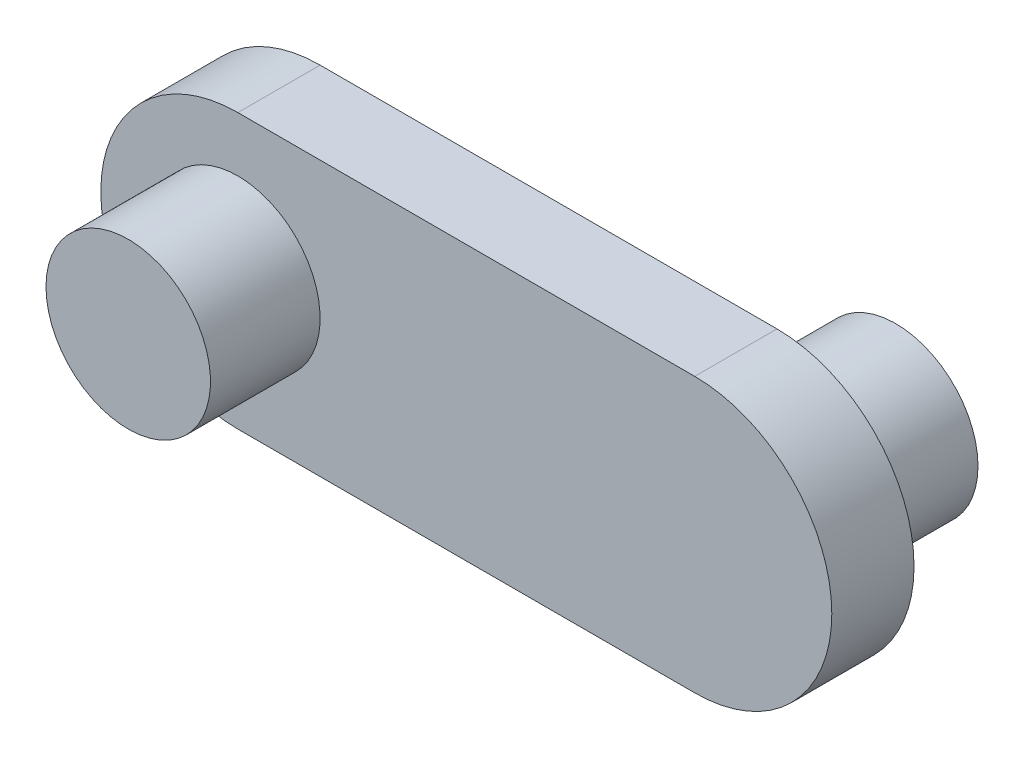
ISO-10303-21;
HEADER;
FILE_DESCRIPTION(('STEP AP214'),'2;1');
FILE_NAME('part.step','',(''),(''),'','','');
FILE_SCHEMA(('AUTOMOTIVE_DESIGN { 1 0 10303 214 1 1 1 1 }'));
ENDSEC;
DATA;
#1=APPLICATION_CONTEXT('core data for automotive mechanical design processes');
#2=APPLICATION_PROTOCOL_DEFINITION('international standard','automotive_design',2000,#1);
#3=PRODUCT_CONTEXT('',#1,'mechanical');
#4=PRODUCT('Part','Part','',(#3));
#5=PRODUCT_RELATED_PRODUCT_CATEGORY('part','',(#4));
#6=PRODUCT_DEFINITION_FORMATION('','',#4);
#7=PRODUCT_DEFINITION_CONTEXT('part definition',#1,'design');
#8=PRODUCT_DEFINITION('design','',#6,#7);
#9=PRODUCT_DEFINITION_SHAPE('','',#8);
#10=(LENGTH_UNIT() NAMED_UNIT(*) SI_UNIT(.MILLI.,.METRE.));
#11=(NAMED_UNIT(*) PLANE_ANGLE_UNIT() SI_UNIT($,.RADIAN.));
#12=(NAMED_UNIT(*) SI_UNIT($,.STERADIAN.) SOLID_ANGLE_UNIT());
#13=UNCERTAINTY_MEASURE_WITH_UNIT(LENGTH_MEASURE(1.E-05),#10,'distance_accuracy_value','');
#14=(GEOMETRIC_REPRESENTATION_CONTEXT(3) GLOBAL_UNCERTAINTY_ASSIGNED_CONTEXT((#13)) GLOBAL_UNIT_ASSIGNED_CONTEXT((#10,
#11,#12)) REPRESENTATION_CONTEXT('',''));
#15=CARTESIAN_POINT('',(0.,0.,0.));
#16=DIRECTION('',(0.,0.,1.));
#17=DIRECTION('',(1.,0.,0.));
#18=AXIS2_PLACEMENT_3D('',#15,#16,#17);
#19=CARTESIAN_POINT('',(41.2075123858607,-1.9691182114518,9.));
#20=DIRECTION('',(0.,0.,-1.));
#21=DIRECTION('',(-1.,0.,0.));
#22=AXIS2_PLACEMENT_3D('',#19,#20,#21);
#23=CYLINDRICAL_SURFACE('',#22,15.);
#24=CARTESIAN_POINT('',(41.2075123858607,-1.9691182114518,0.));
#25=DIRECTION('',(0.,0.,1.));
#26=DIRECTION('',(-1.,0.,0.));
#27=AXIS2_PLACEMENT_3D('',#24,#25,#26);
#28=CIRCLE('',#27,15.);
#29=CARTESIAN_POINT('',(41.2075123858606,-16.9691182114518,0.));
#30=VERTEX_POINT('',#29);
#31=CARTESIAN_POINT('',(41.2075123858606,13.0308817885482,0.));
#32=VERTEX_POINT('',#31);
#33=EDGE_CURVE('E112',#30,#32,#28,.T.);
#34=ORIENTED_EDGE('',*,*,#33,.T.);
#35=DIRECTION('',(0.,0.,-1.));
#36=VECTOR('',#35,1.);
#37=CARTESIAN_POINT('',(41.2075123858606,13.0308817885482,9.));
#38=LINE('',#37,#36);
#39=CARTESIAN_POINT('',(41.2075123858606,13.0308817885482,9.));
#40=VERTEX_POINT('',#39);
#41=EDGE_CURVE('E50',#40,#32,#38,.T.);
#42=ORIENTED_EDGE('',*,*,#41,.F.);
#43=CARTESIAN_POINT('',(41.2075123858607,-1.9691182114518,9.));
#44=DIRECTION('',(0.,0.,1.));
#45=DIRECTION('',(-1.,0.,0.));
#46=AXIS2_PLACEMENT_3D('',#43,#44,#45);
#47=CIRCLE('',#46,15.);
#48=CARTESIAN_POINT('',(41.2075123858606,-16.9691182114518,9.));
#49=VERTEX_POINT('',#48);
#50=EDGE_CURVE('E94',#49,#40,#47,.T.);
#51=ORIENTED_EDGE('',*,*,#50,.F.);
#52=DIRECTION('',(0.,0.,-1.));
#53=VECTOR('',#52,1.);
#54=CARTESIAN_POINT('',(41.2075123858606,-16.9691182114518,9.));
#55=LINE('',#54,#53);
#56=EDGE_CURVE('E108',#49,#30,#55,.T.);
#57=ORIENTED_EDGE('',*,*,#56,.T.);
#58=EDGE_LOOP('',(#34,#42,#51,#57));
#59=FACE_BOUND('',#58,.T.);
#60=ADVANCED_FACE('F41',(#59),#23,.T.);
#61=CARTESIAN_POINT('',(-8.79248761413936,13.0308817885482,9.));
#62=DIRECTION('',(0.,-1.,0.));
#63=DIRECTION('',(0.,0.,-1.));
#64=AXIS2_PLACEMENT_3D('',#61,#62,#63);
#65=PLANE('',#64);
#66=DIRECTION('',(-1.,0.,0.));
#67=VECTOR('',#66,1.);
#68=CARTESIAN_POINT('',(-8.79248761413936,13.0308817885482,0.));
#69=LINE('',#68,#67);
#70=CARTESIAN_POINT('',(-8.79248761413936,13.0308817885482,0.));
#71=VERTEX_POINT('',#70);
#72=EDGE_CURVE('E100',#32,#71,#69,.T.);
#73=ORIENTED_EDGE('',*,*,#72,.T.);
#74=DIRECTION('',(0.,0.,-1.));
#75=VECTOR('',#74,1.);
#76=CARTESIAN_POINT('',(-8.79248761413936,13.0308817885482,9.));
#77=LINE('',#76,#75);
#78=CARTESIAN_POINT('',(-8.79248761413936,13.0308817885482,9.));
#79=VERTEX_POINT('',#78);
#80=EDGE_CURVE('E98',#79,#71,#77,.T.);
#81=ORIENTED_EDGE('',*,*,#80,.F.);
#82=DIRECTION('',(-1.,0.,0.));
#83=VECTOR('',#82,1.);
#84=CARTESIAN_POINT('',(-8.79248761413936,13.0308817885482,9.));
#85=LINE('',#84,#83);
#86=EDGE_CURVE('E89',#40,#79,#85,.T.);
#87=ORIENTED_EDGE('',*,*,#86,.F.);
#88=ORIENTED_EDGE('',*,*,#41,.T.);
#89=EDGE_LOOP('',(#73,#81,#87,#88));
#90=FACE_BOUND('',#89,.T.);
#91=ADVANCED_FACE('F99',(#90),#65,.F.);
#92=CARTESIAN_POINT('',(-8.79248761413936,-1.9691182114518,9.));
#93=DIRECTION('',(0.,0.,-1.));
#94=DIRECTION('',(-1.,0.,0.));
#95=AXIS2_PLACEMENT_3D('',#92,#93,#94);
#96=CYLINDRICAL_SURFACE('',#95,15.);
#97=CARTESIAN_POINT('',(-8.79248761413936,-1.9691182114518,0.));
#98=DIRECTION('',(0.,0.,1.));
#99=DIRECTION('',(1.,0.,0.));
#100=AXIS2_PLACEMENT_3D('',#97,#98,#99);
#101=CIRCLE('',#100,15.);
#102=CARTESIAN_POINT('',(-8.79248761413936,-16.9691182114518,0.));
#103=VERTEX_POINT('',#102);
#104=EDGE_CURVE('E75',#71,#103,#101,.T.);
#105=ORIENTED_EDGE('',*,*,#104,.T.);
#106=DIRECTION('',(0.,0.,-1.));
#107=VECTOR('',#106,1.);
#108=CARTESIAN_POINT('',(-8.79248761413936,-16.9691182114518,9.));
#109=LINE('',#108,#107);
#110=CARTESIAN_POINT('',(-8.79248761413936,-16.9691182114518,9.));
#111=VERTEX_POINT('',#110);
#112=EDGE_CURVE('E102',#111,#103,#109,.T.);
#113=ORIENTED_EDGE('',*,*,#112,.F.);
#114=CARTESIAN_POINT('',(-8.79248761413936,-1.9691182114518,9.));
#115=DIRECTION('',(0.,0.,1.));
#116=DIRECTION('',(1.,0.,0.));
#117=AXIS2_PLACEMENT_3D('',#114,#115,#116);
#118=CIRCLE('',#117,15.);
#119=EDGE_CURVE('E92',#79,#111,#118,.T.);
#120=ORIENTED_EDGE('',*,*,#119,.F.);
#121=ORIENTED_EDGE('',*,*,#80,.T.);
#122=EDGE_LOOP('',(#105,#113,#120,#121));
#123=FACE_BOUND('',#122,.T.);
#124=ADVANCED_FACE('F104',(#123),#96,.T.);
#125=CARTESIAN_POINT('',(41.2075123858606,-16.9691182114518,9.));
#126=DIRECTION('',(0.,1.,0.));
#127=DIRECTION('',(-1.,0.,0.));
#128=AXIS2_PLACEMENT_3D('',#125,#126,#127);
#129=PLANE('',#128);
#130=DIRECTION('',(1.,0.,0.));
#131=VECTOR('',#130,1.);
#132=CARTESIAN_POINT('',(41.2075123858606,-16.9691182114518,0.));
#133=LINE('',#132,#131);
#134=EDGE_CURVE('E81',#103,#30,#133,.T.);
#135=ORIENTED_EDGE('',*,*,#134,.T.);
#136=ORIENTED_EDGE('',*,*,#56,.F.);
#137=DIRECTION('',(1.,0.,0.));
#138=VECTOR('',#137,1.);
#139=CARTESIAN_POINT('',(41.2075123858606,-16.9691182114518,9.));
#140=LINE('',#139,#138);
#141=EDGE_CURVE('E58',#111,#49,#140,.T.);
#142=ORIENTED_EDGE('',*,*,#141,.F.);
#143=ORIENTED_EDGE('',*,*,#112,.T.);
#144=EDGE_LOOP('',(#135,#136,#142,#143));
#145=FACE_BOUND('',#144,.T.);
#146=ADVANCED_FACE('F142',(#145),#129,.F.);
#147=CARTESIAN_POINT('',(41.2075123858607,-1.9691182114518,9.));
#148=DIRECTION('',(0.,0.,-1.));
#149=DIRECTION('',(-1.,0.,0.));
#150=AXIS2_PLACEMENT_3D('',#147,#148,#149);
#151=PLANE('',#150);
#152=CARTESIAN_POINT('',(-8.79248761413936,-1.9691182114518,9.));
#153=DIRECTION('',(0.,0.,-1.));
#154=DIRECTION('',(-1.,0.,0.));
#155=AXIS2_PLACEMENT_3D('',#152,#153,#154);
#156=CIRCLE('',#155,9.);
#157=CARTESIAN_POINT('',(-17.7924876141394,-1.9691182114518,9.));
#158=VERTEX_POINT('',#157);
#159=EDGE_CURVE('E205',#158,#158,#156,.T.);
#160=ORIENTED_EDGE('',*,*,#159,.T.);
#161=EDGE_LOOP('',(#160));
#162=FACE_BOUND('',#161,.T.);
#163=ORIENTED_EDGE('',*,*,#50,.T.);
#164=ORIENTED_EDGE('',*,*,#86,.T.);
#165=ORIENTED_EDGE('',*,*,#119,.T.);
#166=ORIENTED_EDGE('',*,*,#141,.T.);
#167=EDGE_LOOP('',(#163,#164,#165,#166));
#168=FACE_BOUND('',#167,.T.);
#169=ADVANCED_FACE('F90',(#162,#168),#151,.F.);
#170=CARTESIAN_POINT('',(41.2075123858607,-1.9691182114518,0.));
#171=DIRECTION('',(0.,0.,-1.));
#172=DIRECTION('',(-1.,0.,0.));
#173=AXIS2_PLACEMENT_3D('',#170,#171,#172);
#174=PLANE('',#173);
#175=CARTESIAN_POINT('',(41.2075123858606,-1.9691182114518,0.));
#176=DIRECTION('',(0.,0.,-1.));
#177=DIRECTION('',(-1.,0.,0.));
#178=AXIS2_PLACEMENT_3D('',#175,#176,#177);
#179=CIRCLE('',#178,9.);
#180=CARTESIAN_POINT('',(32.2075123858606,-1.9691182114518,0.));
#181=VERTEX_POINT('',#180);
#182=EDGE_CURVE('E11',#181,#181,#179,.T.);
#183=ORIENTED_EDGE('',*,*,#182,.F.);
#184=EDGE_LOOP('',(#183));
#185=FACE_BOUND('',#184,.T.);
#186=ORIENTED_EDGE('',*,*,#33,.F.);
#187=ORIENTED_EDGE('',*,*,#134,.F.);
#188=ORIENTED_EDGE('',*,*,#104,.F.);
#189=ORIENTED_EDGE('',*,*,#72,.F.);
#190=EDGE_LOOP('',(#186,#187,#188,#189));
#191=FACE_BOUND('',#190,.T.);
#192=ADVANCED_FACE('F130',(#185,#191),#174,.T.);
#193=CARTESIAN_POINT('',(-8.79248761413936,-1.9691182114518,21.));
#194=DIRECTION('',(0.,0.,-1.));
#195=DIRECTION('',(-1.,0.,0.));
#196=AXIS2_PLACEMENT_3D('',#193,#194,#195);
#197=CYLINDRICAL_SURFACE('',#196,9.);
#198=CARTESIAN_POINT('',(-8.79248761413936,-1.9691182114518,21.));
#199=DIRECTION('',(0.,0.,-1.));
#200=DIRECTION('',(-1.,0.,0.));
#201=AXIS2_PLACEMENT_3D('',#198,#199,#200);
#202=CIRCLE('',#201,9.);
#203=CARTESIAN_POINT('',(-17.7924876141394,-1.9691182114518,21.));
#204=VERTEX_POINT('',#203);
#205=EDGE_CURVE('E116',#204,#204,#202,.T.);
#206=ORIENTED_EDGE('',*,*,#205,.T.);
#207=EDGE_LOOP('',(#206));
#208=FACE_BOUND('',#207,.T.);
#209=ORIENTED_EDGE('',*,*,#159,.F.);
#210=EDGE_LOOP('',(#209));
#211=FACE_BOUND('',#210,.T.);
#212=ADVANCED_FACE('F132',(#208,#211),#197,.T.);
#213=CARTESIAN_POINT('',(-8.79248761413936,-1.9691182114518,21.));
#214=DIRECTION('',(0.,0.,-1.));
#215=DIRECTION('',(-1.,0.,0.));
#216=AXIS2_PLACEMENT_3D('',#213,#214,#215);
#217=PLANE('',#216);
#218=ORIENTED_EDGE('',*,*,#205,.F.);
#219=EDGE_LOOP('',(#218));
#220=FACE_BOUND('',#219,.T.);
#221=ADVANCED_FACE('F139',(#220),#217,.F.);
#222=CARTESIAN_POINT('',(41.2075123858606,-1.9691182114518,-13.));
#223=DIRECTION('',(0.,0.,1.));
#224=DIRECTION('',(1.,0.,0.));
#225=AXIS2_PLACEMENT_3D('',#222,#223,#224);
#226=CYLINDRICAL_SURFACE('',#225,9.);
#227=ORIENTED_EDGE('',*,*,#182,.T.);
#228=EDGE_LOOP('',(#227));
#229=FACE_BOUND('',#228,.T.);
#230=CARTESIAN_POINT('',(41.2075123858606,-1.9691182114518,-13.));
#231=DIRECTION('',(0.,0.,1.));
#232=DIRECTION('',(1.,0.,0.));
#233=AXIS2_PLACEMENT_3D('',#230,#231,#232);
#234=CIRCLE('',#233,9.);
#235=CARTESIAN_POINT('',(50.2075123858606,-1.9691182114518,-13.));
#236=VERTEX_POINT('',#235);
#237=EDGE_CURVE('E209',#236,#236,#234,.T.);
#238=ORIENTED_EDGE('',*,*,#237,.T.);
#239=EDGE_LOOP('',(#238));
#240=FACE_BOUND('',#239,.T.);
#241=ADVANCED_FACE('F179',(#229,#240),#226,.T.);
#242=CARTESIAN_POINT('',(0.,0.,-13.));
#243=DIRECTION('',(0.,0.,1.));
#244=DIRECTION('',(1.,0.,0.));
#245=AXIS2_PLACEMENT_3D('',#242,#243,#244);
#246=PLANE('',#245);
#247=ORIENTED_EDGE('',*,*,#237,.F.);
#248=EDGE_LOOP('',(#247));
#249=FACE_BOUND('',#248,.T.);
#250=ADVANCED_FACE('F184',(#249),#246,.F.);
#251=CLOSED_SHELL('',(#60,#91,#124,#146,#169,#192,#212,#221,#241,#250));
#252=MANIFOLD_SOLID_BREP('B2',#251);
#253=ADVANCED_BREP_SHAPE_REPRESENTATION('',(#18,#252),#14);
#254=SHAPE_DEFINITION_REPRESENTATION(#9,#253);
ENDSEC;
END-ISO-10303-21;
